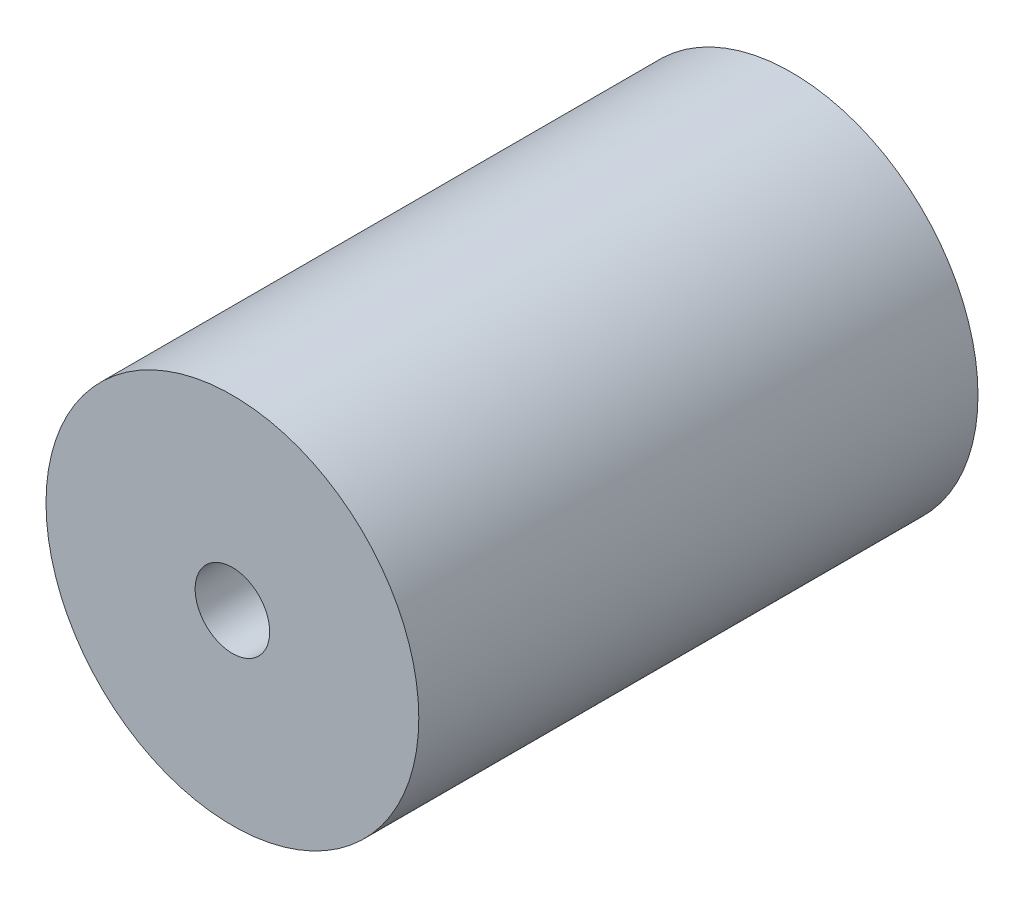
ISO-10303-21;
HEADER;
FILE_DESCRIPTION(('STEP AP214'),'2;1');
FILE_NAME('part.step','',(''),(''),'','','');
FILE_SCHEMA(('AUTOMOTIVE_DESIGN { 1 0 10303 214 1 1 1 1 }'));
ENDSEC;
DATA;
#1=APPLICATION_CONTEXT('core data for automotive mechanical design processes');
#2=APPLICATION_PROTOCOL_DEFINITION('international standard','automotive_design',2000,#1);
#3=PRODUCT_CONTEXT('',#1,'mechanical');
#4=PRODUCT('Part','Part','',(#3));
#5=PRODUCT_RELATED_PRODUCT_CATEGORY('part','',(#4));
#6=PRODUCT_DEFINITION_FORMATION('','',#4);
#7=PRODUCT_DEFINITION_CONTEXT('part definition',#1,'design');
#8=PRODUCT_DEFINITION('design','',#6,#7);
#9=PRODUCT_DEFINITION_SHAPE('','',#8);
#10=(LENGTH_UNIT() NAMED_UNIT(*) SI_UNIT(.MILLI.,.METRE.));
#11=(NAMED_UNIT(*) PLANE_ANGLE_UNIT() SI_UNIT($,.RADIAN.));
#12=(NAMED_UNIT(*) SI_UNIT($,.STERADIAN.) SOLID_ANGLE_UNIT());
#13=UNCERTAINTY_MEASURE_WITH_UNIT(LENGTH_MEASURE(1.E-05),#10,'distance_accuracy_value','');
#14=(GEOMETRIC_REPRESENTATION_CONTEXT(3) GLOBAL_UNCERTAINTY_ASSIGNED_CONTEXT((#13)) GLOBAL_UNIT_ASSIGNED_CONTEXT((#10,
#11,#12)) REPRESENTATION_CONTEXT('',''));
#15=CARTESIAN_POINT('',(0.,0.,0.));
#16=DIRECTION('',(0.,0.,1.));
#17=DIRECTION('',(1.,0.,0.));
#18=AXIS2_PLACEMENT_3D('',#15,#16,#17);
#19=CARTESIAN_POINT('',(0.,0.,0.));
#20=DIRECTION('',(0.,0.,1.));
#21=DIRECTION('',(1.,0.,0.));
#22=AXIS2_PLACEMENT_3D('',#19,#20,#21);
#23=CYLINDRICAL_SURFACE('',#22,2.);
#24=CARTESIAN_POINT('',(0.,0.,30.));
#25=DIRECTION('',(0.,0.,1.));
#26=DIRECTION('',(1.,0.,0.));
#27=AXIS2_PLACEMENT_3D('',#24,#25,#26);
#28=CIRCLE('',#27,2.);
#29=CARTESIAN_POINT('',(2.,0.,30.));
#30=VERTEX_POINT('',#29);
#31=EDGE_CURVE('E58',#30,#30,#28,.T.);
#32=ORIENTED_EDGE('',*,*,#31,.T.);
#33=EDGE_LOOP('',(#32));
#34=FACE_BOUND('',#33,.T.);
#35=CARTESIAN_POINT('',(0.,0.,14.));
#36=DIRECTION('',(0.,0.,-1.));
#37=DIRECTION('',(-1.,0.,0.));
#38=AXIS2_PLACEMENT_3D('',#35,#36,#37);
#39=CIRCLE('',#38,2.);
#40=CARTESIAN_POINT('',(-2.,0.,14.));
#41=VERTEX_POINT('',#40);
#42=EDGE_CURVE('E47',#41,#41,#39,.F.);
#43=ORIENTED_EDGE('',*,*,#42,.F.);
#44=EDGE_LOOP('',(#43));
#45=FACE_BOUND('',#44,.T.);
#46=ADVANCED_FACE('F43',(#34,#45),#23,.F.);
#47=CARTESIAN_POINT('',(0.,0.,30.));
#48=DIRECTION('',(0.,0.,-1.));
#49=DIRECTION('',(-1.,0.,0.));
#50=AXIS2_PLACEMENT_3D('',#47,#48,#49);
#51=CYLINDRICAL_SURFACE('',#50,10.);
#52=CARTESIAN_POINT('',(0.,0.,30.));
#53=DIRECTION('',(0.,0.,1.));
#54=DIRECTION('',(1.,0.,0.));
#55=AXIS2_PLACEMENT_3D('',#52,#53,#54);
#56=CIRCLE('',#55,10.);
#57=CARTESIAN_POINT('',(10.,0.,30.));
#58=VERTEX_POINT('',#57);
#59=EDGE_CURVE('E10',#58,#58,#56,.T.);
#60=ORIENTED_EDGE('',*,*,#59,.F.);
#61=EDGE_LOOP('',(#60));
#62=FACE_BOUND('',#61,.T.);
#63=CARTESIAN_POINT('',(0.,0.,0.));
#64=DIRECTION('',(0.,0.,1.));
#65=DIRECTION('',(1.,0.,0.));
#66=AXIS2_PLACEMENT_3D('',#63,#64,#65);
#67=CIRCLE('',#66,10.);
#68=CARTESIAN_POINT('',(10.,0.,0.));
#69=VERTEX_POINT('',#68);
#70=EDGE_CURVE('E52',#69,#69,#67,.T.);
#71=ORIENTED_EDGE('',*,*,#70,.T.);
#72=EDGE_LOOP('',(#71));
#73=FACE_BOUND('',#72,.T.);
#74=ADVANCED_FACE('F45',(#62,#73),#51,.T.);
#75=CARTESIAN_POINT('',(0.,0.,30.));
#76=DIRECTION('',(0.,0.,1.));
#77=DIRECTION('',(1.,0.,0.));
#78=AXIS2_PLACEMENT_3D('',#75,#76,#77);
#79=PLANE('',#78);
#80=ORIENTED_EDGE('',*,*,#31,.F.);
#81=EDGE_LOOP('',(#80));
#82=FACE_BOUND('',#81,.T.);
#83=ORIENTED_EDGE('',*,*,#59,.T.);
#84=EDGE_LOOP('',(#83));
#85=FACE_BOUND('',#84,.T.);
#86=ADVANCED_FACE('F86',(#82,#85),#79,.T.);
#87=CARTESIAN_POINT('',(0.,0.,0.));
#88=DIRECTION('',(0.,0.,1.));
#89=DIRECTION('',(1.,0.,0.));
#90=AXIS2_PLACEMENT_3D('',#87,#88,#89);
#91=PLANE('',#90);
#92=CARTESIAN_POINT('',(0.,0.,0.));
#93=DIRECTION('',(0.,0.,-1.));
#94=DIRECTION('',(-1.,0.,0.));
#95=AXIS2_PLACEMENT_3D('',#92,#93,#94);
#96=CIRCLE('',#95,3.);
#97=CARTESIAN_POINT('',(-3.,0.,0.));
#98=VERTEX_POINT('',#97);
#99=EDGE_CURVE('E63',#98,#98,#96,.T.);
#100=ORIENTED_EDGE('',*,*,#99,.F.);
#101=EDGE_LOOP('',(#100));
#102=FACE_BOUND('',#101,.T.);
#103=ORIENTED_EDGE('',*,*,#70,.F.);
#104=EDGE_LOOP('',(#103));
#105=FACE_BOUND('',#104,.T.);
#106=ADVANCED_FACE('F92',(#102,#105),#91,.F.);
#107=CARTESIAN_POINT('',(0.,0.,14.));
#108=DIRECTION('',(0.,0.,-1.));
#109=DIRECTION('',(-1.,0.,0.));
#110=AXIS2_PLACEMENT_3D('',#107,#108,#109);
#111=PLANE('',#110);
#112=CARTESIAN_POINT('',(0.,0.,14.));
#113=DIRECTION('',(0.,0.,-1.));
#114=DIRECTION('',(-1.,0.,0.));
#115=AXIS2_PLACEMENT_3D('',#112,#113,#114);
#116=CIRCLE('',#115,3.);
#117=CARTESIAN_POINT('',(-3.,0.,14.));
#118=VERTEX_POINT('',#117);
#119=EDGE_CURVE('E67',#118,#118,#116,.T.);
#120=ORIENTED_EDGE('',*,*,#119,.T.);
#121=EDGE_LOOP('',(#120));
#122=FACE_BOUND('',#121,.T.);
#123=ORIENTED_EDGE('',*,*,#42,.T.);
#124=EDGE_LOOP('',(#123));
#125=FACE_BOUND('',#124,.T.);
#126=ADVANCED_FACE('F76',(#122,#125),#111,.T.);
#127=CARTESIAN_POINT('',(0.,0.,14.));
#128=DIRECTION('',(0.,0.,-1.));
#129=DIRECTION('',(-1.,0.,0.));
#130=AXIS2_PLACEMENT_3D('',#127,#128,#129);
#131=CYLINDRICAL_SURFACE('',#130,3.);
#132=CARTESIAN_POINT('',(-3.,0.,14.));
#133=CARTESIAN_POINT('',(-3.,0.,13.8541666666667));
#134=CARTESIAN_POINT('',(-3.,0.,13.7083333333333));
#135=CARTESIAN_POINT('',(-3.,0.,13.4166666666667));
#136=CARTESIAN_POINT('',(-3.,0.,13.2708333333333));
#137=CARTESIAN_POINT('',(-3.,0.,12.9791666666667));
#138=CARTESIAN_POINT('',(-3.,0.,12.8333333333333));
#139=CARTESIAN_POINT('',(-3.,0.,12.5416666666667));
#140=CARTESIAN_POINT('',(-3.,0.,12.3958333333333));
#141=CARTESIAN_POINT('',(-3.,0.,12.1041666666667));
#142=CARTESIAN_POINT('',(-3.,0.,11.9583333333333));
#143=CARTESIAN_POINT('',(-3.,0.,11.6666666666667));
#144=CARTESIAN_POINT('',(-3.,0.,11.5208333333333));
#145=CARTESIAN_POINT('',(-3.,0.,11.2291666666667));
#146=CARTESIAN_POINT('',(-3.,0.,11.0833333333333));
#147=CARTESIAN_POINT('',(-3.,0.,10.7916666666667));
#148=CARTESIAN_POINT('',(-3.,0.,10.6458333333333));
#149=CARTESIAN_POINT('',(-3.,0.,10.3541666666667));
#150=CARTESIAN_POINT('',(-3.,0.,10.2083333333333));
#151=CARTESIAN_POINT('',(-3.,0.,9.91666666666666));
#152=CARTESIAN_POINT('',(-3.,0.,9.77083333333332));
#153=CARTESIAN_POINT('',(-3.,0.,9.47916666666666));
#154=CARTESIAN_POINT('',(-3.,0.,9.33333333333332));
#155=CARTESIAN_POINT('',(-3.,0.,9.04166666666666));
#156=CARTESIAN_POINT('',(-3.,0.,8.89583333333332));
#157=CARTESIAN_POINT('',(-3.,0.,8.60416666666666));
#158=CARTESIAN_POINT('',(-3.,0.,8.45833333333333));
#159=CARTESIAN_POINT('',(-3.,0.,8.16666666666666));
#160=CARTESIAN_POINT('',(-3.,0.,8.02083333333333));
#161=CARTESIAN_POINT('',(-3.,0.,7.72916666666666));
#162=CARTESIAN_POINT('',(-3.,0.,7.58333333333333));
#163=CARTESIAN_POINT('',(-3.,0.,7.29166666666666));
#164=CARTESIAN_POINT('',(-3.,0.,7.14583333333333));
#165=CARTESIAN_POINT('',(-3.,0.,6.85416666666666));
#166=CARTESIAN_POINT('',(-3.,0.,6.70833333333333));
#167=CARTESIAN_POINT('',(-3.,0.,6.41666666666666));
#168=CARTESIAN_POINT('',(-3.,0.,6.27083333333333));
#169=CARTESIAN_POINT('',(-3.,0.,5.97916666666666));
#170=CARTESIAN_POINT('',(-3.,0.,5.83333333333333));
#171=CARTESIAN_POINT('',(-3.,0.,5.54166666666666));
#172=CARTESIAN_POINT('',(-3.,0.,5.39583333333333));
#173=CARTESIAN_POINT('',(-3.,0.,5.10416666666666));
#174=CARTESIAN_POINT('',(-3.,0.,4.95833333333333));
#175=CARTESIAN_POINT('',(-3.,0.,4.66666666666666));
#176=CARTESIAN_POINT('',(-3.,0.,4.52083333333333));
#177=CARTESIAN_POINT('',(-3.,0.,4.22916666666666));
#178=CARTESIAN_POINT('',(-3.,0.,4.08333333333333));
#179=CARTESIAN_POINT('',(-3.,0.,3.79166666666667));
#180=CARTESIAN_POINT('',(-3.,0.,3.64583333333333));
#181=CARTESIAN_POINT('',(-3.,0.,3.35416666666667));
#182=CARTESIAN_POINT('',(-3.,0.,3.20833333333333));
#183=CARTESIAN_POINT('',(-3.,0.,2.91666666666667));
#184=CARTESIAN_POINT('',(-3.,0.,2.77083333333333));
#185=CARTESIAN_POINT('',(-3.,0.,2.47916666666667));
#186=CARTESIAN_POINT('',(-3.,0.,2.33333333333333));
#187=CARTESIAN_POINT('',(-3.,0.,2.04166666666667));
#188=CARTESIAN_POINT('',(-3.,0.,1.89583333333333));
#189=CARTESIAN_POINT('',(-3.,0.,1.60416666666667));
#190=CARTESIAN_POINT('',(-3.,0.,1.45833333333333));
#191=CARTESIAN_POINT('',(-3.,0.,1.16666666666667));
#192=CARTESIAN_POINT('',(-3.,0.,1.02083333333333));
#193=CARTESIAN_POINT('',(-3.,0.,0.729166666666668));
#194=CARTESIAN_POINT('',(-3.,0.,0.583333333333335));
#195=CARTESIAN_POINT('',(-3.,0.,0.291666666666669));
#196=CARTESIAN_POINT('',(-3.,0.,0.145833333333335));
#197=CARTESIAN_POINT('',(-3.,0.,0.));
#198=B_SPLINE_CURVE_WITH_KNOTS('',3,(#132,#133,#134,#135,#136,#137,#138,#139,#140,#141,#142,
#143,#144,#145,#146,#147,#148,#149,#150,#151,#152,#153,#154,#155,#156,#157,#158,#159,#160,#161,
#162,#163,#164,#165,#166,#167,#168,#169,#170,#171,#172,#173,#174,#175,#176,#177,#178,#179,#180,
#181,#182,#183,#184,#185,#186,#187,#188,#189,#190,#191,#192,#193,#194,#195,#196,#197),
.UNSPECIFIED.,.F.,.F.,(4,2,2,2,2,2,2,2,2,2,2,2,2,2,2,2,2,2,2,2,2,2,2,2,2,2,2,2,2,2,2,2,4),(0.,
0.4375,0.874999999999999,1.3125,1.75,2.1875,2.625,3.0625,3.5,3.9375,4.375,4.8125,5.25,
5.68749999999999,6.12499999999999,6.56249999999999,6.99999999999999,7.43749999999999,
7.87499999999999,8.31249999999999,8.74999999999999,9.18749999999999,9.62499999999999,10.0625,
10.5,10.9375,11.375,11.8125,12.25,12.6875,13.125,13.5625,14.),.UNSPECIFIED.);
#199=EDGE_CURVE('BSEAM90',#118,#98,#198,.T.);
#200=ORIENTED_EDGE('',*,*,#119,.F.);
#201=ORIENTED_EDGE('',*,*,#99,.T.);
#202=ORIENTED_EDGE('',*,*,#199,.T.);
#203=ORIENTED_EDGE('',*,*,#199,.F.);
#204=EDGE_LOOP('',(#200,#202,#201,#203));
#205=FACE_BOUND('',#204,.T.);
#206=ADVANCED_FACE('F90',(#205),#131,.F.);
#207=CLOSED_SHELL('',(#46,#74,#86,#106,#126,#206));
#208=MANIFOLD_SOLID_BREP('B2',#207);
#209=ADVANCED_BREP_SHAPE_REPRESENTATION('',(#18,#208),#14);
#210=SHAPE_DEFINITION_REPRESENTATION(#9,#209);
ENDSEC;
END-ISO-10303-21;
